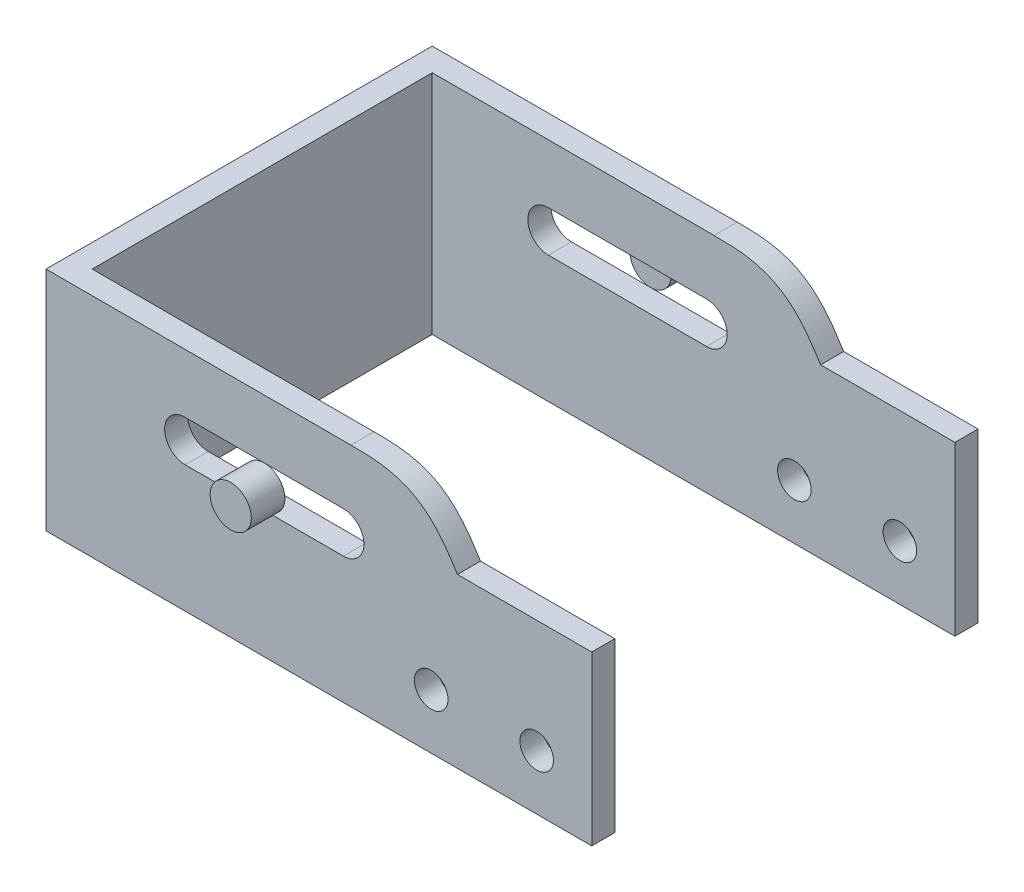
ISO-10303-21;
HEADER;
FILE_DESCRIPTION(('STEP AP214'),'2;1');
FILE_NAME('part.step','',(''),(''),'','','');
FILE_SCHEMA(('AUTOMOTIVE_DESIGN { 1 0 10303 214 1 1 1 1 }'));
ENDSEC;
DATA;
#1=APPLICATION_CONTEXT('core data for automotive mechanical design processes');
#2=APPLICATION_PROTOCOL_DEFINITION('international standard','automotive_design',2000,#1);
#3=PRODUCT_CONTEXT('',#1,'mechanical');
#4=PRODUCT('Part','Part','',(#3));
#5=PRODUCT_RELATED_PRODUCT_CATEGORY('part','',(#4));
#6=PRODUCT_DEFINITION_FORMATION('','',#4);
#7=PRODUCT_DEFINITION_CONTEXT('part definition',#1,'design');
#8=PRODUCT_DEFINITION('design','',#6,#7);
#9=PRODUCT_DEFINITION_SHAPE('','',#8);
#10=(LENGTH_UNIT() NAMED_UNIT(*) SI_UNIT(.MILLI.,.METRE.));
#11=(NAMED_UNIT(*) PLANE_ANGLE_UNIT() SI_UNIT($,.RADIAN.));
#12=(NAMED_UNIT(*) SI_UNIT($,.STERADIAN.) SOLID_ANGLE_UNIT());
#13=UNCERTAINTY_MEASURE_WITH_UNIT(LENGTH_MEASURE(1.E-05),#10,'distance_accuracy_value','');
#14=(GEOMETRIC_REPRESENTATION_CONTEXT(3) GLOBAL_UNCERTAINTY_ASSIGNED_CONTEXT((#13)) GLOBAL_UNIT_ASSIGNED_CONTEXT((#10,
#11,#12)) REPRESENTATION_CONTEXT('',''));
#15=CARTESIAN_POINT('',(0.,0.,0.));
#16=DIRECTION('',(0.,0.,1.));
#17=DIRECTION('',(1.,0.,0.));
#18=AXIS2_PLACEMENT_3D('',#15,#16,#17);
#19=CARTESIAN_POINT('',(-6.49999999999906,4.05000000000166,0.));
#20=DIRECTION('',(0.,0.,-1.));
#21=DIRECTION('',(-1.,0.,0.));
#22=AXIS2_PLACEMENT_3D('',#19,#20,#21);
#23=CYLINDRICAL_SURFACE('',#22,2.4499999999989);
#24=CARTESIAN_POINT('',(-6.49999999999906,4.05000000000166,0.));
#25=DIRECTION('',(0.,0.,1.));
#26=DIRECTION('',(1.,0.,0.));
#27=AXIS2_PLACEMENT_3D('',#24,#25,#26);
#28=CIRCLE('',#27,2.4499999999989);
#29=CARTESIAN_POINT('',(-4.05000000000016,4.05000000000166,0.));
#30=VERTEX_POINT('',#29);
#31=EDGE_CURVE('E11',#30,#30,#28,.T.);
#32=ORIENTED_EDGE('',*,*,#31,.F.);
#33=EDGE_LOOP('',(#32));
#34=FACE_BOUND('',#33,.T.);
#35=CARTESIAN_POINT('',(-6.49999999999906,4.05000000000166,-4.));
#36=DIRECTION('',(0.,0.,1.));
#37=DIRECTION('',(1.,0.,0.));
#38=AXIS2_PLACEMENT_3D('',#35,#36,#37);
#39=CIRCLE('',#38,2.4499999999989);
#40=CARTESIAN_POINT('',(-4.05000000000016,4.05000000000166,-4.));
#41=VERTEX_POINT('',#40);
#42=EDGE_CURVE('E51',#41,#41,#39,.T.);
#43=ORIENTED_EDGE('',*,*,#42,.T.);
#44=EDGE_LOOP('',(#43));
#45=FACE_BOUND('',#44,.T.);
#46=ADVANCED_FACE('F48',(#34,#45),#23,.T.);
#47=CARTESIAN_POINT('',(-6.49999999999906,4.05000000000166,0.));
#48=DIRECTION('',(0.,0.,1.));
#49=DIRECTION('',(1.,0.,0.));
#50=AXIS2_PLACEMENT_3D('',#47,#48,#49);
#51=PLANE('',#50);
#52=ORIENTED_EDGE('',*,*,#31,.T.);
#53=EDGE_LOOP('',(#52));
#54=FACE_BOUND('',#53,.T.);
#55=ADVANCED_FACE('F63',(#54),#51,.T.);
#56=CARTESIAN_POINT('',(-6.49999999999906,4.05000000000166,-4.));
#57=DIRECTION('',(0.,0.,1.));
#58=DIRECTION('',(1.,0.,0.));
#59=AXIS2_PLACEMENT_3D('',#56,#57,#58);
#60=PLANE('',#59);
#61=ORIENTED_EDGE('',*,*,#42,.F.);
#62=EDGE_LOOP('',(#61));
#63=FACE_BOUND('',#62,.T.);
#64=ADVANCED_FACE('F61',(#63),#60,.F.);
#65=CLOSED_SHELL('',(#46,#55,#64));
#66=MANIFOLD_SOLID_BREP('B2',#65);
#67=CARTESIAN_POINT('',(-6.49999999999906,4.05000000000166,50.));
#68=DIRECTION('',(0.,0.,-1.));
#69=DIRECTION('',(-1.,0.,0.));
#70=AXIS2_PLACEMENT_3D('',#67,#68,#69);
#71=CYLINDRICAL_SURFACE('',#70,2.4499999999989);
#72=CARTESIAN_POINT('',(-6.49999999999906,4.05000000000166,50.));
#73=DIRECTION('',(0.,0.,1.));
#74=DIRECTION('',(1.,0.,0.));
#75=AXIS2_PLACEMENT_3D('',#72,#73,#74);
#76=CIRCLE('',#75,2.4499999999989);
#77=CARTESIAN_POINT('',(-4.05000000000016,4.05000000000166,50.));
#78=VERTEX_POINT('',#77);
#79=EDGE_CURVE('E47',#78,#78,#76,.T.);
#80=ORIENTED_EDGE('',*,*,#79,.F.);
#81=EDGE_LOOP('',(#80));
#82=FACE_BOUND('',#81,.T.);
#83=CARTESIAN_POINT('',(-6.49999999999906,4.05000000000166,46.));
#84=DIRECTION('',(0.,0.,1.));
#85=DIRECTION('',(1.,0.,0.));
#86=AXIS2_PLACEMENT_3D('',#83,#84,#85);
#87=CIRCLE('',#86,2.4499999999989);
#88=CARTESIAN_POINT('',(-4.05000000000016,4.05000000000166,46.));
#89=VERTEX_POINT('',#88);
#90=EDGE_CURVE('E107',#89,#89,#87,.T.);
#91=ORIENTED_EDGE('',*,*,#90,.T.);
#92=EDGE_LOOP('',(#91));
#93=FACE_BOUND('',#92,.T.);
#94=ADVANCED_FACE('F104',(#82,#93),#71,.T.);
#95=CARTESIAN_POINT('',(-6.49999999999906,4.05000000000166,50.));
#96=DIRECTION('',(0.,0.,1.));
#97=DIRECTION('',(1.,0.,0.));
#98=AXIS2_PLACEMENT_3D('',#95,#96,#97);
#99=PLANE('',#98);
#100=ORIENTED_EDGE('',*,*,#79,.T.);
#101=EDGE_LOOP('',(#100));
#102=FACE_BOUND('',#101,.T.);
#103=ADVANCED_FACE('F119',(#102),#99,.T.);
#104=CARTESIAN_POINT('',(-6.49999999999906,4.05000000000166,46.));
#105=DIRECTION('',(0.,0.,1.));
#106=DIRECTION('',(1.,0.,0.));
#107=AXIS2_PLACEMENT_3D('',#104,#105,#106);
#108=PLANE('',#107);
#109=ORIENTED_EDGE('',*,*,#90,.F.);
#110=EDGE_LOOP('',(#109));
#111=FACE_BOUND('',#110,.T.);
#112=ADVANCED_FACE('F117',(#111),#108,.F.);
#113=CLOSED_SHELL('',(#94,#103,#112));
#114=MANIFOLD_SOLID_BREP('B6',#113);
#115=CARTESIAN_POINT('',(0.,0.,46.));
#116=DIRECTION('',(0.,0.,1.));
#117=DIRECTION('',(1.,0.,0.));
#118=AXIS2_PLACEMENT_3D('',#115,#116,#117);
#119=PLANE('',#118);
#120=CARTESIAN_POINT('',(13.3799999999979,-6.95499999999831,46.));
#121=DIRECTION('',(0.,0.,1.));
#122=DIRECTION('',(1.,0.,0.));
#123=AXIS2_PLACEMENT_3D('',#120,#121,#122);
#124=CIRCLE('',#123,2.);
#125=CARTESIAN_POINT('',(15.379999999998,-6.95499999999831,46.));
#126=VERTEX_POINT('',#125);
#127=EDGE_CURVE('E330',#126,#126,#124,.T.);
#128=ORIENTED_EDGE('',*,*,#127,.F.);
#129=EDGE_LOOP('',(#128));
#130=FACE_BOUND('',#129,.T.);
#131=CARTESIAN_POINT('',(25.9399999999985,-6.95499999999831,46.));
#132=DIRECTION('',(0.,0.,1.));
#133=DIRECTION('',(1.,0.,0.));
#134=AXIS2_PLACEMENT_3D('',#131,#132,#133);
#135=CIRCLE('',#134,2.);
#136=CARTESIAN_POINT('',(27.9399999999985,-6.95499999999831,46.));
#137=VERTEX_POINT('',#136);
#138=EDGE_CURVE('E702',#137,#137,#135,.T.);
#139=ORIENTED_EDGE('',*,*,#138,.F.);
#140=EDGE_LOOP('',(#139));
#141=FACE_BOUND('',#140,.T.);
#142=DIRECTION('',(-1.,0.,0.));
#143=VECTOR('',#142,1.);
#144=CARTESIAN_POINT('',(16.5000000000006,6.50000000000169,46.));
#145=LINE('',#144,#143);
#146=CARTESIAN_POINT('',(32.4999999999989,6.50000000000169,46.));
#147=VERTEX_POINT('',#146);
#148=CARTESIAN_POINT('',(16.5000000000006,6.50000000000169,46.));
#149=VERTEX_POINT('',#148);
#150=EDGE_CURVE('E478',#147,#149,#145,.T.);
#151=ORIENTED_EDGE('',*,*,#150,.T.);
#152=CARTESIAN_POINT('',(3.81142245955371,13.4999999999992,46.));
#153=CARTESIAN_POINT('',(5.30126616437689,13.4999999999991,46.));
#154=CARTESIAN_POINT('',(6.79110986920007,13.499999999999,46.));
#155=CARTESIAN_POINT('',(10.1156936138264,13.1270812089269,46.));
#156=CARTESIAN_POINT('',(12.8222681179338,11.6339255365632,46.));
#157=CARTESIAN_POINT('',(14.9108333815221,9.02053298290797,46.));
#158=CARTESIAN_POINT('',(15.7054166907613,7.76026649145483,46.));
#159=CARTESIAN_POINT('',(16.5000000000006,6.50000000000169,46.));
#160=B_SPLINE_CURVE_WITH_KNOTS('',5,(#152,#153,#154,#155,#156,#157,#158,#159),.UNSPECIFIED.,.F.,
.F.,(6,2,6),(0.,0.5,1.),.UNSPECIFIED.);
#161=CARTESIAN_POINT('',(3.81142245955367,13.5000000000017,46.));
#162=VERTEX_POINT('',#161);
#163=EDGE_CURVE('E102',#149,#162,#160,.F.);
#164=ORIENTED_EDGE('',*,*,#163,.T.);
#165=DIRECTION('',(-1.,0.,0.));
#166=VECTOR('',#165,1.);
#167=CARTESIAN_POINT('',(-32.4999999999989,13.5000000000017,46.));
#168=LINE('',#167,#166);
#169=CARTESIAN_POINT('',(-32.4999999999989,13.5000000000017,46.));
#170=VERTEX_POINT('',#169);
#171=EDGE_CURVE('E336',#162,#170,#168,.T.);
#172=ORIENTED_EDGE('',*,*,#171,.T.);
#173=DIRECTION('',(0.,-1.,0.));
#174=VECTOR('',#173,1.);
#175=CARTESIAN_POINT('',(-32.4999999999989,13.5000000000017,46.));
#176=LINE('',#175,#174);
#177=CARTESIAN_POINT('',(-32.4999999999989,-13.4999999999983,46.));
#178=VERTEX_POINT('',#177);
#179=EDGE_CURVE('E351',#170,#178,#176,.T.);
#180=ORIENTED_EDGE('',*,*,#179,.T.);
#181=DIRECTION('',(1.,0.,0.));
#182=VECTOR('',#181,1.);
#183=CARTESIAN_POINT('',(-32.4999999999989,-13.4999999999983,46.));
#184=LINE('',#183,#182);
#185=CARTESIAN_POINT('',(32.4999999999989,-13.4999999999983,46.));
#186=VERTEX_POINT('',#185);
#187=EDGE_CURVE('E340',#178,#186,#184,.T.);
#188=ORIENTED_EDGE('',*,*,#187,.T.);
#189=DIRECTION('',(0.,1.,0.));
#190=VECTOR('',#189,1.);
#191=CARTESIAN_POINT('',(32.4999999999989,6.50000000000169,46.));
#192=LINE('',#191,#190);
#193=EDGE_CURVE('E486',#186,#147,#192,.T.);
#194=ORIENTED_EDGE('',*,*,#193,.T.);
#195=EDGE_LOOP('',(#151,#164,#172,#180,#188,#194));
#196=FACE_BOUND('',#195,.T.);
#197=CARTESIAN_POINT('',(-15.9199999999989,4.05000000000166,46.));
#198=DIRECTION('',(0.,0.,1.));
#199=DIRECTION('',(1.,0.,0.));
#200=AXIS2_PLACEMENT_3D('',#197,#198,#199);
#201=CIRCLE('',#200,2.45);
#202=CARTESIAN_POINT('',(-15.9199999999989,6.50000000000166,46.));
#203=VERTEX_POINT('',#202);
#204=CARTESIAN_POINT('',(-15.9199999999989,1.60000000000166,46.));
#205=VERTEX_POINT('',#204);
#206=EDGE_CURVE('E654',#203,#205,#201,.T.);
#207=ORIENTED_EDGE('',*,*,#206,.F.);
#208=DIRECTION('',(1.,0.,0.));
#209=VECTOR('',#208,1.);
#210=CARTESIAN_POINT('',(0.,6.50000000000166,46.));
#211=LINE('',#210,#209);
#212=CARTESIAN_POINT('',(2.92000000000137,6.50000000000166,46.));
#213=VERTEX_POINT('',#212);
#214=EDGE_CURVE('E314',#203,#213,#211,.T.);
#215=ORIENTED_EDGE('',*,*,#214,.T.);
#216=CARTESIAN_POINT('',(2.92000000000137,4.05000000000166,46.));
#217=DIRECTION('',(0.,0.,1.));
#218=DIRECTION('',(1.,0.,0.));
#219=AXIS2_PLACEMENT_3D('',#216,#217,#218);
#220=CIRCLE('',#219,2.45);
#221=CARTESIAN_POINT('',(2.92000000000137,1.60000000000166,46.));
#222=VERTEX_POINT('',#221);
#223=EDGE_CURVE('E659',#222,#213,#220,.T.);
#224=ORIENTED_EDGE('',*,*,#223,.F.);
#225=DIRECTION('',(1.,0.,0.));
#226=VECTOR('',#225,1.);
#227=CARTESIAN_POINT('',(0.,1.60000000000166,46.));
#228=LINE('',#227,#226);
#229=EDGE_CURVE('E649',#205,#222,#228,.T.);
#230=ORIENTED_EDGE('',*,*,#229,.F.);
#231=EDGE_LOOP('',(#207,#215,#224,#230));
#232=FACE_BOUND('',#231,.T.);
#233=ADVANCED_FACE('F151',(#130,#141,#196,#232),#119,.T.);
#234=CARTESIAN_POINT('',(0.,0.,43.25));
#235=DIRECTION('',(0.,0.,-1.));
#236=DIRECTION('',(-1.,0.,0.));
#237=AXIS2_PLACEMENT_3D('',#234,#235,#236);
#238=PLANE('',#237);
#239=CARTESIAN_POINT('',(13.3799999999979,-6.95499999999831,43.25));
#240=DIRECTION('',(0.,0.,-1.));
#241=DIRECTION('',(-1.,0.,0.));
#242=AXIS2_PLACEMENT_3D('',#239,#240,#241);
#243=CIRCLE('',#242,2.);
#244=CARTESIAN_POINT('',(11.3799999999979,-6.95499999999831,43.25));
#245=VERTEX_POINT('',#244);
#246=EDGE_CURVE('E316',#245,#245,#243,.T.);
#247=ORIENTED_EDGE('',*,*,#246,.F.);
#248=EDGE_LOOP('',(#247));
#249=FACE_BOUND('',#248,.T.);
#250=CARTESIAN_POINT('',(25.9399999999985,-6.95499999999831,43.25));
#251=DIRECTION('',(0.,0.,-1.));
#252=DIRECTION('',(-1.,0.,0.));
#253=AXIS2_PLACEMENT_3D('',#250,#251,#252);
#254=CIRCLE('',#253,2.);
#255=CARTESIAN_POINT('',(23.9399999999985,-6.95499999999831,43.25));
#256=VERTEX_POINT('',#255);
#257=EDGE_CURVE('E335',#256,#256,#254,.T.);
#258=ORIENTED_EDGE('',*,*,#257,.F.);
#259=EDGE_LOOP('',(#258));
#260=FACE_BOUND('',#259,.T.);
#261=DIRECTION('',(-1.,0.,0.));
#262=VECTOR('',#261,1.);
#263=CARTESIAN_POINT('',(-32.4999999999989,13.5000000000017,43.25));
#264=LINE('',#263,#262);
#265=CARTESIAN_POINT('',(3.81142245955372,13.4999999999992,43.25));
#266=VERTEX_POINT('',#265);
#267=CARTESIAN_POINT('',(-29.7499999999991,13.5000000000015,43.25));
#268=VERTEX_POINT('',#267);
#269=EDGE_CURVE('E341',#266,#268,#264,.T.);
#270=ORIENTED_EDGE('',*,*,#269,.F.);
#271=CARTESIAN_POINT('',(16.5000000000006,6.50000000000169,43.25));
#272=CARTESIAN_POINT('',(15.7054166907613,7.76026649145483,43.25));
#273=CARTESIAN_POINT('',(14.9108333815221,9.02053298290797,43.25));
#274=CARTESIAN_POINT('',(12.8222681179338,11.6339255365632,43.25));
#275=CARTESIAN_POINT('',(10.1156936138264,13.1270812089269,43.25));
#276=CARTESIAN_POINT('',(6.79110986920007,13.499999999999,43.25));
#277=CARTESIAN_POINT('',(5.30126616437689,13.4999999999991,43.25));
#278=CARTESIAN_POINT('',(3.81142245955372,13.4999999999992,43.25));
#279=B_SPLINE_CURVE_WITH_KNOTS('',5,(#271,#272,#273,#274,#275,#276,#277,#278),.UNSPECIFIED.,.F.,
.F.,(6,2,6),(0.,0.5,1.),.UNSPECIFIED.);
#280=CARTESIAN_POINT('',(16.5000000000006,6.50000000000169,43.25));
#281=VERTEX_POINT('',#280);
#282=EDGE_CURVE('E166',#266,#281,#279,.F.);
#283=ORIENTED_EDGE('',*,*,#282,.T.);
#284=DIRECTION('',(-1.,0.,0.));
#285=VECTOR('',#284,1.);
#286=CARTESIAN_POINT('',(16.5000000000006,6.50000000000169,43.25));
#287=LINE('',#286,#285);
#288=CARTESIAN_POINT('',(32.4999999999989,6.50000000000169,43.25));
#289=VERTEX_POINT('',#288);
#290=EDGE_CURVE('E446',#289,#281,#287,.T.);
#291=ORIENTED_EDGE('',*,*,#290,.F.);
#292=DIRECTION('',(0.,1.,0.));
#293=VECTOR('',#292,1.);
#294=CARTESIAN_POINT('',(32.4999999999989,6.50000000000169,43.25));
#295=LINE('',#294,#293);
#296=CARTESIAN_POINT('',(32.4999999999989,-13.4999999999983,43.25));
#297=VERTEX_POINT('',#296);
#298=EDGE_CURVE('E548',#297,#289,#295,.T.);
#299=ORIENTED_EDGE('',*,*,#298,.F.);
#300=DIRECTION('',(1.,0.,0.));
#301=VECTOR('',#300,1.);
#302=CARTESIAN_POINT('',(-32.4999999999989,-13.4999999999983,43.25));
#303=LINE('',#302,#301);
#304=CARTESIAN_POINT('',(-29.7499999999991,-13.4999999999983,43.25));
#305=VERTEX_POINT('',#304);
#306=EDGE_CURVE('E542',#305,#297,#303,.T.);
#307=ORIENTED_EDGE('',*,*,#306,.F.);
#308=DIRECTION('',(0.,-1.,0.));
#309=VECTOR('',#308,1.);
#310=CARTESIAN_POINT('',(-29.7499999999991,13.5000000000017,43.25));
#311=LINE('',#310,#309);
#312=EDGE_CURVE('E306',#268,#305,#311,.T.);
#313=ORIENTED_EDGE('',*,*,#312,.F.);
#314=EDGE_LOOP('',(#270,#283,#291,#299,#307,#313));
#315=FACE_BOUND('',#314,.T.);
#316=CARTESIAN_POINT('',(2.92000000000137,4.05000000000166,43.25));
#317=DIRECTION('',(0.,0.,-1.));
#318=DIRECTION('',(-1.,0.,0.));
#319=AXIS2_PLACEMENT_3D('',#316,#317,#318);
#320=CIRCLE('',#319,2.45);
#321=CARTESIAN_POINT('',(2.92000000000137,6.50000000000166,43.25));
#322=VERTEX_POINT('',#321);
#323=CARTESIAN_POINT('',(2.92000000000137,1.60000000000166,43.25));
#324=VERTEX_POINT('',#323);
#325=EDGE_CURVE('E320',#322,#324,#320,.T.);
#326=ORIENTED_EDGE('',*,*,#325,.F.);
#327=DIRECTION('',(-1.,0.,0.));
#328=VECTOR('',#327,1.);
#329=CARTESIAN_POINT('',(0.,6.50000000000166,43.25));
#330=LINE('',#329,#328);
#331=CARTESIAN_POINT('',(-15.9199999999989,6.50000000000166,43.25));
#332=VERTEX_POINT('',#331);
#333=EDGE_CURVE('E311',#322,#332,#330,.T.);
#334=ORIENTED_EDGE('',*,*,#333,.T.);
#335=CARTESIAN_POINT('',(-15.9199999999989,4.05000000000166,43.25));
#336=DIRECTION('',(0.,0.,-1.));
#337=DIRECTION('',(-1.,0.,0.));
#338=AXIS2_PLACEMENT_3D('',#335,#336,#337);
#339=CIRCLE('',#338,2.45);
#340=CARTESIAN_POINT('',(-15.9199999999989,1.60000000000166,43.25));
#341=VERTEX_POINT('',#340);
#342=EDGE_CURVE('E294',#341,#332,#339,.T.);
#343=ORIENTED_EDGE('',*,*,#342,.F.);
#344=DIRECTION('',(-1.,0.,0.));
#345=VECTOR('',#344,1.);
#346=CARTESIAN_POINT('',(0.,1.60000000000166,43.25));
#347=LINE('',#346,#345);
#348=EDGE_CURVE('E305',#324,#341,#347,.T.);
#349=ORIENTED_EDGE('',*,*,#348,.F.);
#350=EDGE_LOOP('',(#326,#334,#343,#349));
#351=FACE_BOUND('',#350,.T.);
#352=ADVANCED_FACE('F319',(#249,#260,#315,#351),#238,.T.);
#353=CARTESIAN_POINT('',(0.,0.,2.75));
#354=DIRECTION('',(0.,0.,-1.));
#355=DIRECTION('',(-1.,0.,0.));
#356=AXIS2_PLACEMENT_3D('',#353,#354,#355);
#357=PLANE('',#356);
#358=CARTESIAN_POINT('',(13.3799999999979,-6.95499999999831,2.75));
#359=DIRECTION('',(0.,0.,-1.));
#360=DIRECTION('',(-1.,0.,0.));
#361=AXIS2_PLACEMENT_3D('',#358,#359,#360);
#362=CIRCLE('',#361,2.);
#363=CARTESIAN_POINT('',(11.3799999999979,-6.95499999999831,2.75));
#364=VERTEX_POINT('',#363);
#365=EDGE_CURVE('E334',#364,#364,#362,.T.);
#366=ORIENTED_EDGE('',*,*,#365,.T.);
#367=EDGE_LOOP('',(#366));
#368=FACE_BOUND('',#367,.T.);
#369=CARTESIAN_POINT('',(25.9399999999985,-6.95499999999831,2.75));
#370=DIRECTION('',(0.,0.,-1.));
#371=DIRECTION('',(-1.,0.,0.));
#372=AXIS2_PLACEMENT_3D('',#369,#370,#371);
#373=CIRCLE('',#372,2.);
#374=CARTESIAN_POINT('',(23.9399999999985,-6.95499999999831,2.75));
#375=VERTEX_POINT('',#374);
#376=EDGE_CURVE('E329',#375,#375,#373,.T.);
#377=ORIENTED_EDGE('',*,*,#376,.T.);
#378=EDGE_LOOP('',(#377));
#379=FACE_BOUND('',#378,.T.);
#380=DIRECTION('',(-1.,0.,0.));
#381=VECTOR('',#380,1.);
#382=CARTESIAN_POINT('',(0.,6.50000000000166,2.75));
#383=LINE('',#382,#381);
#384=CARTESIAN_POINT('',(2.92000000000137,6.50000000000166,2.75));
#385=VERTEX_POINT('',#384);
#386=CARTESIAN_POINT('',(-15.9199999999989,6.50000000000166,2.75));
#387=VERTEX_POINT('',#386);
#388=EDGE_CURVE('E376',#385,#387,#383,.T.);
#389=ORIENTED_EDGE('',*,*,#388,.F.);
#390=CARTESIAN_POINT('',(2.92000000000137,4.05000000000166,2.75));
#391=DIRECTION('',(0.,0.,-1.));
#392=DIRECTION('',(-1.,0.,0.));
#393=AXIS2_PLACEMENT_3D('',#390,#391,#392);
#394=CIRCLE('',#393,2.45);
#395=CARTESIAN_POINT('',(2.92000000000137,1.60000000000166,2.75));
#396=VERTEX_POINT('',#395);
#397=EDGE_CURVE('E373',#385,#396,#394,.T.);
#398=ORIENTED_EDGE('',*,*,#397,.T.);
#399=DIRECTION('',(-1.,0.,0.));
#400=VECTOR('',#399,1.);
#401=CARTESIAN_POINT('',(0.,1.60000000000166,2.75));
#402=LINE('',#401,#400);
#403=CARTESIAN_POINT('',(-15.9199999999989,1.60000000000166,2.75));
#404=VERTEX_POINT('',#403);
#405=EDGE_CURVE('E370',#396,#404,#402,.T.);
#406=ORIENTED_EDGE('',*,*,#405,.T.);
#407=CARTESIAN_POINT('',(-15.9199999999989,4.05000000000166,2.75));
#408=DIRECTION('',(0.,0.,-1.));
#409=DIRECTION('',(-1.,0.,0.));
#410=AXIS2_PLACEMENT_3D('',#407,#408,#409);
#411=CIRCLE('',#410,2.45);
#412=EDGE_CURVE('E367',#404,#387,#411,.T.);
#413=ORIENTED_EDGE('',*,*,#412,.T.);
#414=EDGE_LOOP('',(#389,#398,#406,#413));
#415=FACE_BOUND('',#414,.T.);
#416=DIRECTION('',(0.,1.,0.));
#417=VECTOR('',#416,1.);
#418=CARTESIAN_POINT('',(-29.7499999999991,13.5000000000017,2.75));
#419=LINE('',#418,#417);
#420=CARTESIAN_POINT('',(-29.7499999999991,-13.4999999999983,2.75));
#421=VERTEX_POINT('',#420);
#422=CARTESIAN_POINT('',(-29.7499999999991,13.5000000000017,2.75));
#423=VERTEX_POINT('',#422);
#424=EDGE_CURVE('E348',#421,#423,#419,.T.);
#425=ORIENTED_EDGE('',*,*,#424,.F.);
#426=DIRECTION('',(1.,0.,0.));
#427=VECTOR('',#426,1.);
#428=CARTESIAN_POINT('',(-32.4999999999989,-13.4999999999983,2.75));
#429=LINE('',#428,#427);
#430=CARTESIAN_POINT('',(32.4999999999989,-13.4999999999983,2.75));
#431=VERTEX_POINT('',#430);
#432=EDGE_CURVE('E380',#421,#431,#429,.T.);
#433=ORIENTED_EDGE('',*,*,#432,.T.);
#434=DIRECTION('',(0.,1.,0.));
#435=VECTOR('',#434,1.);
#436=CARTESIAN_POINT('',(32.4999999999989,6.50000000000169,2.75));
#437=LINE('',#436,#435);
#438=CARTESIAN_POINT('',(32.4999999999989,6.50000000000169,2.75));
#439=VERTEX_POINT('',#438);
#440=EDGE_CURVE('E382',#431,#439,#437,.T.);
#441=ORIENTED_EDGE('',*,*,#440,.T.);
#442=DIRECTION('',(-1.,0.,0.));
#443=VECTOR('',#442,1.);
#444=CARTESIAN_POINT('',(16.5000000000006,6.50000000000169,2.75));
#445=LINE('',#444,#443);
#446=CARTESIAN_POINT('',(16.5000000000006,6.50000000000169,2.75));
#447=VERTEX_POINT('',#446);
#448=EDGE_CURVE('E385',#439,#447,#445,.T.);
#449=ORIENTED_EDGE('',*,*,#448,.T.);
#450=CARTESIAN_POINT('',(3.81142245955372,13.4999999999992,2.75));
#451=CARTESIAN_POINT('',(5.30126616437689,13.4999999999991,2.75));
#452=CARTESIAN_POINT('',(6.79110986920007,13.499999999999,2.75));
#453=CARTESIAN_POINT('',(10.1156936138264,13.1270812089269,2.75));
#454=CARTESIAN_POINT('',(12.8222681179338,11.6339255365632,2.75));
#455=CARTESIAN_POINT('',(14.9108333815221,9.02053298290797,2.75));
#456=CARTESIAN_POINT('',(15.7054166907613,7.76026649145483,2.75));
#457=CARTESIAN_POINT('',(16.5000000000006,6.50000000000169,2.75));
#458=B_SPLINE_CURVE_WITH_KNOTS('',5,(#450,#451,#452,#453,#454,#455,#456,#457),.UNSPECIFIED.,.F.,
.F.,(6,2,6),(0.,0.5,1.),.UNSPECIFIED.);
#459=CARTESIAN_POINT('',(3.81142245955372,13.4999999999992,2.75));
#460=VERTEX_POINT('',#459);
#461=EDGE_CURVE('E564',#447,#460,#458,.F.);
#462=ORIENTED_EDGE('',*,*,#461,.T.);
#463=DIRECTION('',(-1.,0.,0.));
#464=VECTOR('',#463,1.);
#465=CARTESIAN_POINT('',(-32.4999999999989,13.5000000000017,2.75));
#466=LINE('',#465,#464);
#467=EDGE_CURVE('E390',#460,#423,#466,.T.);
#468=ORIENTED_EDGE('',*,*,#467,.T.);
#469=EDGE_LOOP('',(#425,#433,#441,#449,#462,#468));
#470=FACE_BOUND('',#469,.T.);
#471=ADVANCED_FACE('F456',(#368,#379,#415,#470),#357,.F.);
#472=CARTESIAN_POINT('',(0.,0.,0.));
#473=DIRECTION('',(0.,0.,-1.));
#474=DIRECTION('',(-1.,0.,0.));
#475=AXIS2_PLACEMENT_3D('',#472,#473,#474);
#476=PLANE('',#475);
#477=CARTESIAN_POINT('',(13.3799999999979,-6.95499999999831,0.));
#478=DIRECTION('',(0.,0.,-1.));
#479=DIRECTION('',(-1.,0.,0.));
#480=AXIS2_PLACEMENT_3D('',#477,#478,#479);
#481=CIRCLE('',#480,2.);
#482=CARTESIAN_POINT('',(11.3799999999979,-6.95499999999831,0.));
#483=VERTEX_POINT('',#482);
#484=EDGE_CURVE('E331',#483,#483,#481,.T.);
#485=ORIENTED_EDGE('',*,*,#484,.F.);
#486=EDGE_LOOP('',(#485));
#487=FACE_BOUND('',#486,.T.);
#488=CARTESIAN_POINT('',(25.9399999999985,-6.95499999999831,0.));
#489=DIRECTION('',(0.,0.,-1.));
#490=DIRECTION('',(-1.,0.,0.));
#491=AXIS2_PLACEMENT_3D('',#488,#489,#490);
#492=CIRCLE('',#491,2.);
#493=CARTESIAN_POINT('',(23.9399999999985,-6.95499999999831,0.));
#494=VERTEX_POINT('',#493);
#495=EDGE_CURVE('E326',#494,#494,#492,.T.);
#496=ORIENTED_EDGE('',*,*,#495,.F.);
#497=EDGE_LOOP('',(#496));
#498=FACE_BOUND('',#497,.T.);
#499=DIRECTION('',(-1.,0.,0.));
#500=VECTOR('',#499,1.);
#501=CARTESIAN_POINT('',(-32.4999999999989,13.5000000000017,0.));
#502=LINE('',#501,#500);
#503=CARTESIAN_POINT('',(3.81142245955372,13.4999999999992,0.));
#504=VERTEX_POINT('',#503);
#505=CARTESIAN_POINT('',(-32.4999999999989,13.5000000000017,0.));
#506=VERTEX_POINT('',#505);
#507=EDGE_CURVE('E383',#504,#506,#502,.T.);
#508=ORIENTED_EDGE('',*,*,#507,.F.);
#509=CARTESIAN_POINT('',(16.5000000000006,6.50000000000169,0.));
#510=CARTESIAN_POINT('',(15.7054166907613,7.76026649145483,0.));
#511=CARTESIAN_POINT('',(14.9108333815221,9.02053298290797,0.));
#512=CARTESIAN_POINT('',(12.8222681179338,11.6339255365632,0.));
#513=CARTESIAN_POINT('',(10.1156936138264,13.1270812089269,0.));
#514=CARTESIAN_POINT('',(6.79110986920007,13.499999999999,0.));
#515=CARTESIAN_POINT('',(5.30126616437689,13.4999999999991,0.));
#516=CARTESIAN_POINT('',(3.81142245955372,13.4999999999992,0.));
#517=B_SPLINE_CURVE_WITH_KNOTS('',5,(#509,#510,#511,#512,#513,#514,#515,#516),.UNSPECIFIED.,.F.,
.F.,(6,2,6),(0.,0.5,1.),.UNSPECIFIED.);
#518=CARTESIAN_POINT('',(16.5000000000006,6.50000000000169,0.));
#519=VERTEX_POINT('',#518);
#520=EDGE_CURVE('E570',#504,#519,#517,.F.);
#521=ORIENTED_EDGE('',*,*,#520,.T.);
#522=DIRECTION('',(-1.,0.,0.));
#523=VECTOR('',#522,1.);
#524=CARTESIAN_POINT('',(16.5000000000006,6.50000000000169,0.));
#525=LINE('',#524,#523);
#526=CARTESIAN_POINT('',(32.4999999999989,6.50000000000169,0.));
#527=VERTEX_POINT('',#526);
#528=EDGE_CURVE('E756',#527,#519,#525,.T.);
#529=ORIENTED_EDGE('',*,*,#528,.F.);
#530=DIRECTION('',(0.,1.,0.));
#531=VECTOR('',#530,1.);
#532=CARTESIAN_POINT('',(32.4999999999989,6.50000000000169,0.));
#533=LINE('',#532,#531);
#534=CARTESIAN_POINT('',(32.4999999999989,-13.4999999999983,0.));
#535=VERTEX_POINT('',#534);
#536=EDGE_CURVE('E762',#535,#527,#533,.T.);
#537=ORIENTED_EDGE('',*,*,#536,.F.);
#538=DIRECTION('',(1.,0.,0.));
#539=VECTOR('',#538,1.);
#540=CARTESIAN_POINT('',(-32.4999999999989,-13.4999999999983,0.));
#541=LINE('',#540,#539);
#542=CARTESIAN_POINT('',(-32.4999999999989,-13.4999999999983,0.));
#543=VERTEX_POINT('',#542);
#544=EDGE_CURVE('E764',#543,#535,#541,.T.);
#545=ORIENTED_EDGE('',*,*,#544,.F.);
#546=DIRECTION('',(0.,-1.,0.));
#547=VECTOR('',#546,1.);
#548=CARTESIAN_POINT('',(-32.4999999999989,-13.4999999999983,0.));
#549=LINE('',#548,#547);
#550=EDGE_CURVE('E379',#506,#543,#549,.T.);
#551=ORIENTED_EDGE('',*,*,#550,.F.);
#552=EDGE_LOOP('',(#508,#521,#529,#537,#545,#551));
#553=FACE_BOUND('',#552,.T.);
#554=CARTESIAN_POINT('',(2.92000000000137,4.05000000000166,0.));
#555=DIRECTION('',(0.,0.,-1.));
#556=DIRECTION('',(-1.,0.,0.));
#557=AXIS2_PLACEMENT_3D('',#554,#555,#556);
#558=CIRCLE('',#557,2.45);
#559=CARTESIAN_POINT('',(2.92000000000137,6.50000000000166,0.));
#560=VERTEX_POINT('',#559);
#561=CARTESIAN_POINT('',(2.92000000000137,1.60000000000166,0.));
#562=VERTEX_POINT('',#561);
#563=EDGE_CURVE('E640',#560,#562,#558,.T.);
#564=ORIENTED_EDGE('',*,*,#563,.F.);
#565=DIRECTION('',(-1.,0.,0.));
#566=VECTOR('',#565,1.);
#567=CARTESIAN_POINT('',(0.,6.50000000000166,0.));
#568=LINE('',#567,#566);
#569=CARTESIAN_POINT('',(-15.9199999999989,6.50000000000166,0.));
#570=VERTEX_POINT('',#569);
#571=EDGE_CURVE('E554',#560,#570,#568,.T.);
#572=ORIENTED_EDGE('',*,*,#571,.T.);
#573=CARTESIAN_POINT('',(-15.9199999999989,4.05000000000166,0.));
#574=DIRECTION('',(0.,0.,-1.));
#575=DIRECTION('',(-1.,0.,0.));
#576=AXIS2_PLACEMENT_3D('',#573,#574,#575);
#577=CIRCLE('',#576,2.45);
#578=CARTESIAN_POINT('',(-15.9199999999989,1.60000000000166,0.));
#579=VERTEX_POINT('',#578);
#580=EDGE_CURVE('E630',#579,#570,#577,.T.);
#581=ORIENTED_EDGE('',*,*,#580,.F.);
#582=DIRECTION('',(-1.,0.,0.));
#583=VECTOR('',#582,1.);
#584=CARTESIAN_POINT('',(0.,1.60000000000166,0.));
#585=LINE('',#584,#583);
#586=EDGE_CURVE('E637',#562,#579,#585,.T.);
#587=ORIENTED_EDGE('',*,*,#586,.F.);
#588=EDGE_LOOP('',(#564,#572,#581,#587));
#589=FACE_BOUND('',#588,.T.);
#590=ADVANCED_FACE('F422',(#487,#498,#553,#589),#476,.T.);
#591=CARTESIAN_POINT('',(-32.4999999999989,-13.4999999999983,2.75));
#592=DIRECTION('',(1.,0.,0.));
#593=DIRECTION('',(0.,0.,-1.));
#594=AXIS2_PLACEMENT_3D('',#591,#592,#593);
#595=PLANE('',#594);
#596=ORIENTED_EDGE('',*,*,#550,.T.);
#597=DIRECTION('',(0.,0.,-1.));
#598=VECTOR('',#597,1.);
#599=CARTESIAN_POINT('',(-32.4999999999989,-13.4999999999983,2.75));
#600=LINE('',#599,#598);
#601=EDGE_CURVE('E572',#178,#543,#600,.T.);
#602=ORIENTED_EDGE('',*,*,#601,.F.);
#603=ORIENTED_EDGE('',*,*,#179,.F.);
#604=DIRECTION('',(0.,0.,-1.));
#605=VECTOR('',#604,1.);
#606=CARTESIAN_POINT('',(-32.4999999999989,13.5000000000017,2.75));
#607=LINE('',#606,#605);
#608=EDGE_CURVE('E394',#170,#506,#607,.T.);
#609=ORIENTED_EDGE('',*,*,#608,.T.);
#610=EDGE_LOOP('',(#596,#602,#603,#609));
#611=FACE_BOUND('',#610,.T.);
#612=ADVANCED_FACE('F594',(#611),#595,.F.);
#613=CARTESIAN_POINT('',(-32.4999999999989,-13.4999999999983,2.75));
#614=DIRECTION('',(0.,1.,0.));
#615=DIRECTION('',(-1.,0.,0.));
#616=AXIS2_PLACEMENT_3D('',#613,#614,#615);
#617=PLANE('',#616);
#618=DIRECTION('',(0.,0.,-1.));
#619=VECTOR('',#618,1.);
#620=CARTESIAN_POINT('',(-29.7499999999991,-13.4999999999983,46.));
#621=LINE('',#620,#619);
#622=EDGE_CURVE('E354',#305,#421,#621,.T.);
#623=ORIENTED_EDGE('',*,*,#622,.F.);
#624=ORIENTED_EDGE('',*,*,#306,.T.);
#625=DIRECTION('',(0.,0.,-1.));
#626=VECTOR('',#625,1.);
#627=CARTESIAN_POINT('',(32.4999999999989,-13.4999999999983,46.));
#628=LINE('',#627,#626);
#629=EDGE_CURVE('E352',#186,#297,#628,.T.);
#630=ORIENTED_EDGE('',*,*,#629,.F.);
#631=ORIENTED_EDGE('',*,*,#187,.F.);
#632=ORIENTED_EDGE('',*,*,#601,.T.);
#633=ORIENTED_EDGE('',*,*,#544,.T.);
#634=DIRECTION('',(0.,0.,-1.));
#635=VECTOR('',#634,1.);
#636=CARTESIAN_POINT('',(32.4999999999989,-13.4999999999983,2.75));
#637=LINE('',#636,#635);
#638=EDGE_CURVE('E559',#431,#535,#637,.T.);
#639=ORIENTED_EDGE('',*,*,#638,.F.);
#640=ORIENTED_EDGE('',*,*,#432,.F.);
#641=EDGE_LOOP('',(#623,#624,#630,#631,#632,#633,#639,#640));
#642=FACE_BOUND('',#641,.T.);
#643=ADVANCED_FACE('F541',(#642),#617,.F.);
#644=CARTESIAN_POINT('',(32.4999999999989,6.50000000000169,2.75));
#645=DIRECTION('',(-1.,0.,0.));
#646=DIRECTION('',(0.,0.,1.));
#647=AXIS2_PLACEMENT_3D('',#644,#645,#646);
#648=PLANE('',#647);
#649=ORIENTED_EDGE('',*,*,#536,.T.);
#650=DIRECTION('',(0.,0.,-1.));
#651=VECTOR('',#650,1.);
#652=CARTESIAN_POINT('',(32.4999999999989,6.50000000000169,2.75));
#653=LINE('',#652,#651);
#654=EDGE_CURVE('E754',#439,#527,#653,.T.);
#655=ORIENTED_EDGE('',*,*,#654,.F.);
#656=ORIENTED_EDGE('',*,*,#440,.F.);
#657=ORIENTED_EDGE('',*,*,#638,.T.);
#658=EDGE_LOOP('',(#649,#655,#656,#657));
#659=FACE_BOUND('',#658,.T.);
#660=ADVANCED_FACE('F786',(#659),#648,.F.);
#661=CARTESIAN_POINT('',(16.5000000000006,6.50000000000169,2.75));
#662=DIRECTION('',(0.,-1.,0.));
#663=DIRECTION('',(0.,0.,-1.));
#664=AXIS2_PLACEMENT_3D('',#661,#662,#663);
#665=PLANE('',#664);
#666=ORIENTED_EDGE('',*,*,#528,.T.);
#667=CARTESIAN_POINT('',(16.5000000000006,6.50000000000169,2.8875));
#668=CARTESIAN_POINT('',(16.5000000000006,6.50000000000169,1.87916666666631));
#669=CARTESIAN_POINT('',(16.5000000000006,6.50000000000169,0.870833333333333));
#670=CARTESIAN_POINT('',(16.5000000000006,6.50000000000169,-0.1375));
#671=B_SPLINE_CURVE_WITH_KNOTS('',3,(#667,#668,#669,#670),.UNSPECIFIED.,.F.,.F.,(4,4),
(-0.0001375,0.0028875),.UNSPECIFIED.);
#672=EDGE_CURVE('E614',#447,#519,#671,.T.);
#673=ORIENTED_EDGE('',*,*,#672,.F.);
#674=ORIENTED_EDGE('',*,*,#448,.F.);
#675=ORIENTED_EDGE('',*,*,#654,.T.);
#676=EDGE_LOOP('',(#666,#673,#674,#675));
#677=FACE_BOUND('',#676,.T.);
#678=ADVANCED_FACE('F421',(#677),#665,.F.);
#679=CARTESIAN_POINT('',(-32.4999999999989,13.5000000000017,2.75));
#680=DIRECTION('',(0.,-1.,0.));
#681=DIRECTION('',(1.,0.,0.));
#682=AXIS2_PLACEMENT_3D('',#679,#680,#681);
#683=PLANE('',#682);
#684=ORIENTED_EDGE('',*,*,#171,.F.);
#685=CARTESIAN_POINT('',(3.81142245955372,13.4999999999992,43.1125));
#686=CARTESIAN_POINT('',(3.81142245955372,13.4999999999992,44.1208333333333));
#687=CARTESIAN_POINT('',(3.81142245955372,13.4999999999992,45.1291666666667));
#688=CARTESIAN_POINT('',(3.81142245955372,13.4999999999992,46.1375));
#689=B_SPLINE_CURVE_WITH_KNOTS('',3,(#685,#686,#687,#688),.UNSPECIFIED.,.F.,.F.,(4,4),
(-0.0433875,-0.0403625),.UNSPECIFIED.);
#690=EDGE_CURVE('E321',#162,#266,#689,.F.);
#691=ORIENTED_EDGE('',*,*,#690,.T.);
#692=ORIENTED_EDGE('',*,*,#269,.T.);
#693=DIRECTION('',(0.,0.,-1.));
#694=VECTOR('',#693,1.);
#695=CARTESIAN_POINT('',(-29.7499999999991,13.5000000000017,46.));
#696=LINE('',#695,#694);
#697=EDGE_CURVE('E339',#268,#423,#696,.T.);
#698=ORIENTED_EDGE('',*,*,#697,.T.);
#699=ORIENTED_EDGE('',*,*,#467,.F.);
#700=CARTESIAN_POINT('',(3.81142245955372,13.4999999999992,-0.1375));
#701=CARTESIAN_POINT('',(3.81142245955372,13.4999999999992,0.870833333333333));
#702=CARTESIAN_POINT('',(3.81142245955372,13.4999999999992,1.87916666666631));
#703=CARTESIAN_POINT('',(3.81142245955372,13.4999999999992,2.8875));
#704=B_SPLINE_CURVE_WITH_KNOTS('',3,(#700,#701,#702,#703),.UNSPECIFIED.,.F.,.F.,(4,4),
(-0.0001375,0.0028875),.UNSPECIFIED.);
#705=EDGE_CURVE('E403',#460,#504,#704,.F.);
#706=ORIENTED_EDGE('',*,*,#705,.T.);
#707=ORIENTED_EDGE('',*,*,#507,.T.);
#708=ORIENTED_EDGE('',*,*,#608,.F.);
#709=EDGE_LOOP('',(#684,#691,#692,#698,#699,#706,#707,#708));
#710=FACE_BOUND('',#709,.T.);
#711=ADVANCED_FACE('F410',(#710),#683,.F.);
#712=CARTESIAN_POINT('',(3.81142245955372,13.4999999999992,2.8875));
#713=CARTESIAN_POINT('',(3.81142245955372,13.4999999999992,1.87916666666631));
#714=CARTESIAN_POINT('',(3.81142245955372,13.4999999999992,0.870833333333333));
#715=CARTESIAN_POINT('',(3.81142245955372,13.4999999999992,-0.1375));
#716=CARTESIAN_POINT('',(5.30126616437689,13.4999999999991,2.8875));
#717=CARTESIAN_POINT('',(5.30126616437689,13.4999999999991,1.87916666666631));
#718=CARTESIAN_POINT('',(5.30126616437689,13.4999999999991,0.870833333333333));
#719=CARTESIAN_POINT('',(5.30126616437689,13.4999999999991,-0.1375));
#720=CARTESIAN_POINT('',(6.79110986920007,13.499999999999,2.8875));
#721=CARTESIAN_POINT('',(6.79110986920007,13.499999999999,1.87916666666631));
#722=CARTESIAN_POINT('',(6.79110986920007,13.499999999999,0.870833333333333));
#723=CARTESIAN_POINT('',(6.79110986920007,13.499999999999,-0.1375));
#724=CARTESIAN_POINT('',(10.1156936138264,13.1270812089269,2.8875));
#725=CARTESIAN_POINT('',(10.1156936138264,13.1270812089269,1.87916666666631));
#726=CARTESIAN_POINT('',(10.1156936138264,13.1270812089269,0.870833333333333));
#727=CARTESIAN_POINT('',(10.1156936138264,13.1270812089269,-0.1375));
#728=CARTESIAN_POINT('',(12.8222681179338,11.6339255365632,2.8875));
#729=CARTESIAN_POINT('',(12.8222681179338,11.6339255365632,1.87916666666631));
#730=CARTESIAN_POINT('',(12.8222681179338,11.6339255365632,0.870833333333333));
#731=CARTESIAN_POINT('',(12.8222681179338,11.6339255365632,-0.1375));
#732=CARTESIAN_POINT('',(14.9108333815221,9.02053298290797,2.8875));
#733=CARTESIAN_POINT('',(14.9108333815221,9.02053298290797,1.87916666666631));
#734=CARTESIAN_POINT('',(14.9108333815221,9.02053298290797,0.870833333333333));
#735=CARTESIAN_POINT('',(14.9108333815221,9.02053298290797,-0.1375));
#736=CARTESIAN_POINT('',(15.7054166907613,7.76026649145483,2.8875));
#737=CARTESIAN_POINT('',(15.7054166907613,7.76026649145483,1.87916666666631));
#738=CARTESIAN_POINT('',(15.7054166907613,7.76026649145483,0.870833333333333));
#739=CARTESIAN_POINT('',(15.7054166907613,7.76026649145483,-0.1375));
#740=CARTESIAN_POINT('',(16.5000000000006,6.50000000000169,2.8875));
#741=CARTESIAN_POINT('',(16.5000000000006,6.50000000000169,1.87916666666631));
#742=CARTESIAN_POINT('',(16.5000000000006,6.50000000000169,0.870833333333333));
#743=CARTESIAN_POINT('',(16.5000000000006,6.50000000000169,-0.1375));
#744=B_SPLINE_SURFACE_WITH_KNOTS('',5,3,((#712,#713,#714,#715),(#716,#717,#718,#719),(#720,#721,
#722,#723),(#724,#725,#726,#727),(#728,#729,#730,#731),(#732,#733,#734,#735),(#736,#737,#738,
#739),(#740,#741,#742,#743)),.UNSPECIFIED.,.F.,.F.,.F.,(6,2,6),(4,4),(0.,0.5,1.),(-0.0001375,
0.0028875),.UNSPECIFIED.);
#745=ORIENTED_EDGE('',*,*,#461,.F.);
#746=ORIENTED_EDGE('',*,*,#672,.T.);
#747=ORIENTED_EDGE('',*,*,#520,.F.);
#748=ORIENTED_EDGE('',*,*,#705,.F.);
#749=EDGE_LOOP('',(#745,#746,#747,#748));
#750=FACE_BOUND('',#749,.T.);
#751=ADVANCED_FACE('F420',(#750),#744,.T.);
#752=CARTESIAN_POINT('',(-15.9199999999989,6.50000000000166,-0.0500000000000196));
#753=DIRECTION('',(0.,-1.,0.));
#754=DIRECTION('',(1.,0.,0.));
#755=AXIS2_PLACEMENT_3D('',#752,#753,#754);
#756=PLANE('',#755);
#757=ORIENTED_EDGE('',*,*,#388,.T.);
#758=DIRECTION('',(0.,0.,1.));
#759=VECTOR('',#758,1.);
#760=CARTESIAN_POINT('',(-15.9199999999989,6.50000000000166,-0.0500000000000196));
#761=LINE('',#760,#759);
#762=EDGE_CURVE('E356',#570,#387,#761,.T.);
#763=ORIENTED_EDGE('',*,*,#762,.F.);
#764=ORIENTED_EDGE('',*,*,#571,.F.);
#765=DIRECTION('',(0.,0.,1.));
#766=VECTOR('',#765,1.);
#767=CARTESIAN_POINT('',(2.92000000000137,6.50000000000166,-0.0500000000000196));
#768=LINE('',#767,#766);
#769=EDGE_CURVE('E364',#560,#385,#768,.T.);
#770=ORIENTED_EDGE('',*,*,#769,.T.);
#771=EDGE_LOOP('',(#757,#763,#764,#770));
#772=FACE_BOUND('',#771,.T.);
#773=ADVANCED_FACE('F593',(#772),#756,.T.);
#774=CARTESIAN_POINT('',(2.92000000000137,4.05000000000166,-0.0500000000000196));
#775=DIRECTION('',(0.,0.,1.));
#776=DIRECTION('',(1.,0.,0.));
#777=AXIS2_PLACEMENT_3D('',#774,#775,#776);
#778=CYLINDRICAL_SURFACE('',#777,2.45);
#779=ORIENTED_EDGE('',*,*,#769,.F.);
#780=ORIENTED_EDGE('',*,*,#563,.T.);
#781=DIRECTION('',(0.,0.,1.));
#782=VECTOR('',#781,1.);
#783=CARTESIAN_POINT('',(2.92000000000137,1.60000000000166,-0.0500000000000196));
#784=LINE('',#783,#782);
#785=EDGE_CURVE('E361',#562,#396,#784,.T.);
#786=ORIENTED_EDGE('',*,*,#785,.T.);
#787=ORIENTED_EDGE('',*,*,#397,.F.);
#788=EDGE_LOOP('',(#779,#780,#786,#787));
#789=FACE_BOUND('',#788,.T.);
#790=ADVANCED_FACE('F721',(#789),#778,.F.);
#791=CARTESIAN_POINT('',(-15.9199999999989,1.60000000000166,-0.0500000000000196));
#792=DIRECTION('',(0.,-1.,0.));
#793=DIRECTION('',(1.,0.,0.));
#794=AXIS2_PLACEMENT_3D('',#791,#792,#793);
#795=PLANE('',#794);
#796=ORIENTED_EDGE('',*,*,#785,.F.);
#797=ORIENTED_EDGE('',*,*,#586,.T.);
#798=DIRECTION('',(0.,0.,1.));
#799=VECTOR('',#798,1.);
#800=CARTESIAN_POINT('',(-15.9199999999989,1.60000000000166,-0.0500000000000196));
#801=LINE('',#800,#799);
#802=EDGE_CURVE('E358',#579,#404,#801,.T.);
#803=ORIENTED_EDGE('',*,*,#802,.T.);
#804=ORIENTED_EDGE('',*,*,#405,.F.);
#805=EDGE_LOOP('',(#796,#797,#803,#804));
#806=FACE_BOUND('',#805,.T.);
#807=ADVANCED_FACE('F727',(#806),#795,.F.);
#808=CARTESIAN_POINT('',(-15.9199999999989,4.05000000000166,-0.0500000000000196));
#809=DIRECTION('',(0.,0.,1.));
#810=DIRECTION('',(1.,0.,0.));
#811=AXIS2_PLACEMENT_3D('',#808,#809,#810);
#812=CYLINDRICAL_SURFACE('',#811,2.45);
#813=ORIENTED_EDGE('',*,*,#802,.F.);
#814=ORIENTED_EDGE('',*,*,#580,.T.);
#815=ORIENTED_EDGE('',*,*,#762,.T.);
#816=ORIENTED_EDGE('',*,*,#412,.F.);
#817=EDGE_LOOP('',(#813,#814,#815,#816));
#818=FACE_BOUND('',#817,.T.);
#819=ADVANCED_FACE('F729',(#818),#812,.F.);
#820=CARTESIAN_POINT('',(-29.7499999999991,13.5000000000017,46.));
#821=DIRECTION('',(-1.,0.,0.));
#822=DIRECTION('',(0.,0.,1.));
#823=AXIS2_PLACEMENT_3D('',#820,#821,#822);
#824=PLANE('',#823);
#825=ORIENTED_EDGE('',*,*,#697,.F.);
#826=ORIENTED_EDGE('',*,*,#312,.T.);
#827=ORIENTED_EDGE('',*,*,#622,.T.);
#828=ORIENTED_EDGE('',*,*,#424,.T.);
#829=EDGE_LOOP('',(#825,#826,#827,#828));
#830=FACE_BOUND('',#829,.T.);
#831=ADVANCED_FACE('F467',(#830),#824,.F.);
#832=CARTESIAN_POINT('',(32.4999999999989,6.50000000000169,46.));
#833=DIRECTION('',(-1.,0.,0.));
#834=DIRECTION('',(0.,0.,1.));
#835=AXIS2_PLACEMENT_3D('',#832,#833,#834);
#836=PLANE('',#835);
#837=ORIENTED_EDGE('',*,*,#298,.T.);
#838=DIRECTION('',(0.,0.,-1.));
#839=VECTOR('',#838,1.);
#840=CARTESIAN_POINT('',(32.4999999999989,6.50000000000169,46.));
#841=LINE('',#840,#839);
#842=EDGE_CURVE('E526',#147,#289,#841,.T.);
#843=ORIENTED_EDGE('',*,*,#842,.F.);
#844=ORIENTED_EDGE('',*,*,#193,.F.);
#845=ORIENTED_EDGE('',*,*,#629,.T.);
#846=EDGE_LOOP('',(#837,#843,#844,#845));
#847=FACE_BOUND('',#846,.T.);
#848=ADVANCED_FACE('F463',(#847),#836,.F.);
#849=CARTESIAN_POINT('',(16.5000000000006,6.50000000000169,46.));
#850=DIRECTION('',(0.,-1.,0.));
#851=DIRECTION('',(0.,0.,-1.));
#852=AXIS2_PLACEMENT_3D('',#849,#850,#851);
#853=PLANE('',#852);
#854=ORIENTED_EDGE('',*,*,#290,.T.);
#855=CARTESIAN_POINT('',(16.5000000000006,6.50000000000169,46.1375));
#856=CARTESIAN_POINT('',(16.5000000000006,6.50000000000169,45.1291666666667));
#857=CARTESIAN_POINT('',(16.5000000000006,6.50000000000169,44.1208333333333));
#858=CARTESIAN_POINT('',(16.5000000000006,6.50000000000169,43.1125));
#859=B_SPLINE_CURVE_WITH_KNOTS('',3,(#855,#856,#857,#858),.UNSPECIFIED.,.F.,.F.,(4,4),
(-0.0433875,-0.0403625),.UNSPECIFIED.);
#860=EDGE_CURVE('E485',#149,#281,#859,.T.);
#861=ORIENTED_EDGE('',*,*,#860,.F.);
#862=ORIENTED_EDGE('',*,*,#150,.F.);
#863=ORIENTED_EDGE('',*,*,#842,.T.);
#864=EDGE_LOOP('',(#854,#861,#862,#863));
#865=FACE_BOUND('',#864,.T.);
#866=ADVANCED_FACE('F459',(#865),#853,.F.);
#867=CARTESIAN_POINT('',(-15.9199999999989,6.50000000000166,-0.0500000000016598));
#868=DIRECTION('',(0.,-1.,0.));
#869=DIRECTION('',(1.,0.,0.));
#870=AXIS2_PLACEMENT_3D('',#867,#868,#869);
#871=PLANE('',#870);
#872=DIRECTION('',(0.,0.,1.));
#873=VECTOR('',#872,1.);
#874=CARTESIAN_POINT('',(-15.9199999999989,6.50000000000166,-0.0500000000016598));
#875=LINE('',#874,#873);
#876=EDGE_CURVE('E297',#332,#203,#875,.T.);
#877=ORIENTED_EDGE('',*,*,#876,.F.);
#878=ORIENTED_EDGE('',*,*,#333,.F.);
#879=DIRECTION('',(0.,0.,1.));
#880=VECTOR('',#879,1.);
#881=CARTESIAN_POINT('',(2.92000000000137,6.50000000000166,-0.0500000000016598));
#882=LINE('',#881,#880);
#883=EDGE_CURVE('E652',#322,#213,#882,.T.);
#884=ORIENTED_EDGE('',*,*,#883,.T.);
#885=ORIENTED_EDGE('',*,*,#214,.F.);
#886=EDGE_LOOP('',(#877,#878,#884,#885));
#887=FACE_BOUND('',#886,.T.);
#888=ADVANCED_FACE('F309',(#887),#871,.T.);
#889=CARTESIAN_POINT('',(2.92000000000137,4.05000000000166,-0.0500000000016598));
#890=DIRECTION('',(0.,0.,1.));
#891=DIRECTION('',(1.,0.,0.));
#892=AXIS2_PLACEMENT_3D('',#889,#890,#891);
#893=CYLINDRICAL_SURFACE('',#892,2.45);
#894=ORIENTED_EDGE('',*,*,#223,.T.);
#895=ORIENTED_EDGE('',*,*,#883,.F.);
#896=ORIENTED_EDGE('',*,*,#325,.T.);
#897=DIRECTION('',(0.,0.,1.));
#898=VECTOR('',#897,1.);
#899=CARTESIAN_POINT('',(2.92000000000137,1.60000000000166,-0.0500000000016598));
#900=LINE('',#899,#898);
#901=EDGE_CURVE('E648',#324,#222,#900,.T.);
#902=ORIENTED_EDGE('',*,*,#901,.T.);
#903=EDGE_LOOP('',(#894,#895,#896,#902));
#904=FACE_BOUND('',#903,.T.);
#905=ADVANCED_FACE('F660',(#904),#893,.F.);
#906=CARTESIAN_POINT('',(-15.9199999999989,1.60000000000166,-0.0500000000016598));
#907=DIRECTION('',(0.,-1.,0.));
#908=DIRECTION('',(1.,0.,0.));
#909=AXIS2_PLACEMENT_3D('',#906,#907,#908);
#910=PLANE('',#909);
#911=ORIENTED_EDGE('',*,*,#229,.T.);
#912=ORIENTED_EDGE('',*,*,#901,.F.);
#913=ORIENTED_EDGE('',*,*,#348,.T.);
#914=DIRECTION('',(0.,0.,1.));
#915=VECTOR('',#914,1.);
#916=CARTESIAN_POINT('',(-15.9199999999989,1.60000000000166,-0.0500000000016598));
#917=LINE('',#916,#915);
#918=EDGE_CURVE('E300',#341,#205,#917,.T.);
#919=ORIENTED_EDGE('',*,*,#918,.T.);
#920=EDGE_LOOP('',(#911,#912,#913,#919));
#921=FACE_BOUND('',#920,.T.);
#922=ADVANCED_FACE('F645',(#921),#910,.F.);
#923=CARTESIAN_POINT('',(-15.9199999999989,4.05000000000166,-0.0500000000016598));
#924=DIRECTION('',(0.,0.,1.));
#925=DIRECTION('',(1.,0.,0.));
#926=AXIS2_PLACEMENT_3D('',#923,#924,#925);
#927=CYLINDRICAL_SURFACE('',#926,2.45);
#928=ORIENTED_EDGE('',*,*,#206,.T.);
#929=ORIENTED_EDGE('',*,*,#918,.F.);
#930=ORIENTED_EDGE('',*,*,#342,.T.);
#931=ORIENTED_EDGE('',*,*,#876,.T.);
#932=EDGE_LOOP('',(#928,#929,#930,#931));
#933=FACE_BOUND('',#932,.T.);
#934=ADVANCED_FACE('F296',(#933),#927,.F.);
#935=CARTESIAN_POINT('',(25.9399999999985,-6.95499999999831,-4.));
#936=DIRECTION('',(0.,0.,1.));
#937=DIRECTION('',(1.,0.,0.));
#938=AXIS2_PLACEMENT_3D('',#935,#936,#937);
#939=CYLINDRICAL_SURFACE('',#938,2.);
#940=ORIENTED_EDGE('',*,*,#495,.T.);
#941=EDGE_LOOP('',(#940));
#942=FACE_BOUND('',#941,.T.);
#943=ORIENTED_EDGE('',*,*,#376,.F.);
#944=EDGE_LOOP('',(#943));
#945=FACE_BOUND('',#944,.T.);
#946=ADVANCED_FACE('F670',(#942,#945),#939,.F.);
#947=CARTESIAN_POINT('',(13.3799999999979,-6.95499999999831,-4.));
#948=DIRECTION('',(0.,0.,1.));
#949=DIRECTION('',(1.,0.,0.));
#950=AXIS2_PLACEMENT_3D('',#947,#948,#949);
#951=CYLINDRICAL_SURFACE('',#950,2.);
#952=ORIENTED_EDGE('',*,*,#484,.T.);
#953=EDGE_LOOP('',(#952));
#954=FACE_BOUND('',#953,.T.);
#955=ORIENTED_EDGE('',*,*,#365,.F.);
#956=EDGE_LOOP('',(#955));
#957=FACE_BOUND('',#956,.T.);
#958=ADVANCED_FACE('F675',(#954,#957),#951,.F.);
#959=ORIENTED_EDGE('',*,*,#257,.T.);
#960=EDGE_LOOP('',(#959));
#961=FACE_BOUND('',#960,.T.);
#962=ORIENTED_EDGE('',*,*,#138,.T.);
#963=EDGE_LOOP('',(#962));
#964=FACE_BOUND('',#963,.T.);
#965=ADVANCED_FACE('F671',(#961,#964),#939,.F.);
#966=ORIENTED_EDGE('',*,*,#246,.T.);
#967=EDGE_LOOP('',(#966));
#968=FACE_BOUND('',#967,.T.);
#969=ORIENTED_EDGE('',*,*,#127,.T.);
#970=EDGE_LOOP('',(#969));
#971=FACE_BOUND('',#970,.T.);
#972=ADVANCED_FACE('F674',(#968,#971),#951,.F.);
#973=CARTESIAN_POINT('',(3.81142245955372,13.4999999999992,46.1375));
#974=CARTESIAN_POINT('',(3.81142245955372,13.4999999999992,45.1291666666667));
#975=CARTESIAN_POINT('',(3.81142245955372,13.4999999999992,44.1208333333333));
#976=CARTESIAN_POINT('',(3.81142245955372,13.4999999999992,43.1125));
#977=CARTESIAN_POINT('',(5.30126616437689,13.4999999999991,46.1375));
#978=CARTESIAN_POINT('',(5.30126616437689,13.4999999999991,45.1291666666667));
#979=CARTESIAN_POINT('',(5.30126616437689,13.4999999999991,44.1208333333333));
#980=CARTESIAN_POINT('',(5.30126616437689,13.4999999999991,43.1125));
#981=CARTESIAN_POINT('',(6.79110986920007,13.499999999999,46.1375));
#982=CARTESIAN_POINT('',(6.79110986920007,13.499999999999,45.1291666666667));
#983=CARTESIAN_POINT('',(6.79110986920007,13.499999999999,44.1208333333333));
#984=CARTESIAN_POINT('',(6.79110986920007,13.499999999999,43.1125));
#985=CARTESIAN_POINT('',(10.1156936138264,13.1270812089269,46.1375));
#986=CARTESIAN_POINT('',(10.1156936138264,13.1270812089269,45.1291666666667));
#987=CARTESIAN_POINT('',(10.1156936138264,13.1270812089269,44.1208333333333));
#988=CARTESIAN_POINT('',(10.1156936138264,13.1270812089269,43.1125));
#989=CARTESIAN_POINT('',(12.8222681179338,11.6339255365632,46.1375));
#990=CARTESIAN_POINT('',(12.8222681179338,11.6339255365632,45.1291666666667));
#991=CARTESIAN_POINT('',(12.8222681179338,11.6339255365632,44.1208333333333));
#992=CARTESIAN_POINT('',(12.8222681179338,11.6339255365632,43.1125));
#993=CARTESIAN_POINT('',(14.9108333815221,9.02053298290797,46.1375));
#994=CARTESIAN_POINT('',(14.9108333815221,9.02053298290797,45.1291666666667));
#995=CARTESIAN_POINT('',(14.9108333815221,9.02053298290797,44.1208333333333));
#996=CARTESIAN_POINT('',(14.9108333815221,9.02053298290797,43.1125));
#997=CARTESIAN_POINT('',(15.7054166907613,7.76026649145483,46.1375));
#998=CARTESIAN_POINT('',(15.7054166907613,7.76026649145483,45.1291666666667));
#999=CARTESIAN_POINT('',(15.7054166907613,7.76026649145483,44.1208333333333));
#1000=CARTESIAN_POINT('',(15.7054166907613,7.76026649145483,43.1125));
#1001=CARTESIAN_POINT('',(16.5000000000006,6.50000000000169,46.1375));
#1002=CARTESIAN_POINT('',(16.5000000000006,6.50000000000169,45.1291666666667));
#1003=CARTESIAN_POINT('',(16.5000000000006,6.50000000000169,44.1208333333333));
#1004=CARTESIAN_POINT('',(16.5000000000006,6.50000000000169,43.1125));
#1005=B_SPLINE_SURFACE_WITH_KNOTS('',5,3,((#973,#974,#975,#976),(#977,#978,#979,#980),(#981,
#982,#983,#984),(#985,#986,#987,#988),(#989,#990,#991,#992),(#993,#994,#995,#996),(#997,#998,
#999,#1000),(#1001,#1002,#1003,#1004)),.UNSPECIFIED.,.F.,.F.,.F.,(6,2,6),(4,4),(0.,0.5,1.),
(-0.0433875,-0.0403625),.UNSPECIFIED.);
#1006=ORIENTED_EDGE('',*,*,#163,.F.);
#1007=ORIENTED_EDGE('',*,*,#860,.T.);
#1008=ORIENTED_EDGE('',*,*,#282,.F.);
#1009=ORIENTED_EDGE('',*,*,#690,.F.);
#1010=EDGE_LOOP('',(#1006,#1007,#1008,#1009));
#1011=FACE_BOUND('',#1010,.T.);
#1012=ADVANCED_FACE('F154',(#1011),#1005,.T.);
#1013=CLOSED_SHELL('',(#233,#352,#471,#590,#612,#643,#660,#678,#711,#751,#773,#790,#807,#819,
#831,#848,#866,#888,#905,#922,#934,#946,#958,#965,#972,#1012));
#1014=MANIFOLD_SOLID_BREP('B42',#1013);
#1015=ADVANCED_BREP_SHAPE_REPRESENTATION('',(#18,#66,#114,#1014),#14);
#1016=SHAPE_DEFINITION_REPRESENTATION(#9,#1015);
ENDSEC;
END-ISO-10303-21;
